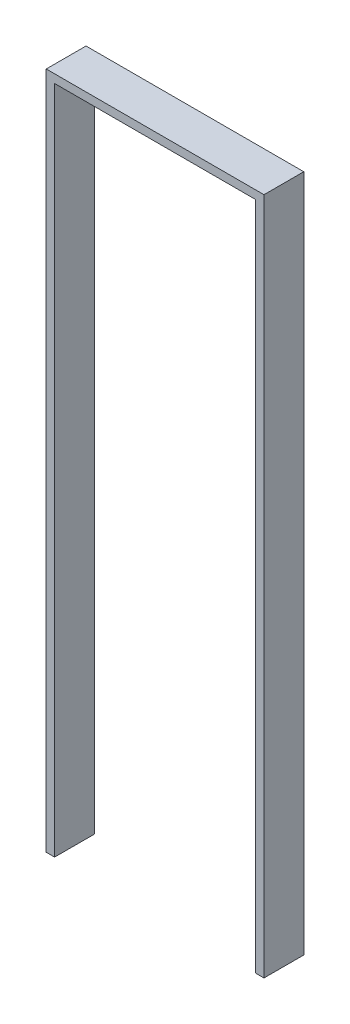
ISO-10303-21;
HEADER;
FILE_DESCRIPTION(('STEP AP214'),'2;1');
FILE_NAME('part.step','',(''),(''),'','','');
FILE_SCHEMA(('AUTOMOTIVE_DESIGN { 1 0 10303 214 1 1 1 1 }'));
ENDSEC;
DATA;
#1=APPLICATION_CONTEXT('core data for automotive mechanical design processes');
#2=APPLICATION_PROTOCOL_DEFINITION('international standard','automotive_design',2000,#1);
#3=PRODUCT_CONTEXT('',#1,'mechanical');
#4=PRODUCT('Part','Part','',(#3));
#5=PRODUCT_RELATED_PRODUCT_CATEGORY('part','',(#4));
#6=PRODUCT_DEFINITION_FORMATION('','',#4);
#7=PRODUCT_DEFINITION_CONTEXT('part definition',#1,'design');
#8=PRODUCT_DEFINITION('design','',#6,#7);
#9=PRODUCT_DEFINITION_SHAPE('','',#8);
#10=(LENGTH_UNIT() NAMED_UNIT(*) SI_UNIT(.MILLI.,.METRE.));
#11=(NAMED_UNIT(*) PLANE_ANGLE_UNIT() SI_UNIT($,.RADIAN.));
#12=(NAMED_UNIT(*) SI_UNIT($,.STERADIAN.) SOLID_ANGLE_UNIT());
#13=UNCERTAINTY_MEASURE_WITH_UNIT(LENGTH_MEASURE(1.E-05),#10,'distance_accuracy_value','');
#14=(GEOMETRIC_REPRESENTATION_CONTEXT(3) GLOBAL_UNCERTAINTY_ASSIGNED_CONTEXT((#13)) GLOBAL_UNIT_ASSIGNED_CONTEXT((#10,
#11,#12)) REPRESENTATION_CONTEXT('',''));
#15=CARTESIAN_POINT('',(0.,0.,0.));
#16=DIRECTION('',(0.,0.,1.));
#17=DIRECTION('',(1.,0.,0.));
#18=AXIS2_PLACEMENT_3D('',#15,#16,#17);
#19=CARTESIAN_POINT('',(-330.2,0.,-120.65));
#20=DIRECTION('',(0.,-1.,0.));
#21=DIRECTION('',(0.,0.,-1.));
#22=AXIS2_PLACEMENT_3D('',#19,#20,#21);
#23=PLANE('',#22);
#24=DIRECTION('',(1.,0.,0.));
#25=VECTOR('',#24,1.);
#26=CARTESIAN_POINT('',(-330.2,0.,0.));
#27=LINE('',#26,#25);
#28=CARTESIAN_POINT('',(-330.2,0.,0.));
#29=VERTEX_POINT('',#28);
#30=CARTESIAN_POINT('',(-304.8,0.,0.));
#31=VERTEX_POINT('',#30);
#32=EDGE_CURVE('E129',#29,#31,#27,.T.);
#33=ORIENTED_EDGE('',*,*,#32,.F.);
#34=DIRECTION('',(0.,0.,1.));
#35=VECTOR('',#34,1.);
#36=CARTESIAN_POINT('',(-330.2,0.,-120.65));
#37=LINE('',#36,#35);
#38=CARTESIAN_POINT('',(-330.2,0.,-120.65));
#39=VERTEX_POINT('',#38);
#40=EDGE_CURVE('E11',#39,#29,#37,.T.);
#41=ORIENTED_EDGE('',*,*,#40,.F.);
#42=DIRECTION('',(1.,0.,0.));
#43=VECTOR('',#42,1.);
#44=CARTESIAN_POINT('',(-330.2,0.,-120.65));
#45=LINE('',#44,#43);
#46=CARTESIAN_POINT('',(-304.8,0.,-120.65));
#47=VERTEX_POINT('',#46);
#48=EDGE_CURVE('E149',#39,#47,#45,.T.);
#49=ORIENTED_EDGE('',*,*,#48,.T.);
#50=DIRECTION('',(0.,0.,1.));
#51=VECTOR('',#50,1.);
#52=CARTESIAN_POINT('',(-304.8,0.,-120.65));
#53=LINE('',#52,#51);
#54=EDGE_CURVE('E35',#47,#31,#53,.T.);
#55=ORIENTED_EDGE('',*,*,#54,.T.);
#56=EDGE_LOOP('',(#33,#41,#49,#55));
#57=FACE_BOUND('',#56,.T.);
#58=ADVANCED_FACE('F32',(#57),#23,.T.);
#59=CARTESIAN_POINT('',(-330.2,2057.4,-120.65));
#60=DIRECTION('',(-1.,0.,0.));
#61=DIRECTION('',(0.,0.,1.));
#62=AXIS2_PLACEMENT_3D('',#59,#60,#61);
#63=PLANE('',#62);
#64=DIRECTION('',(0.,-1.,0.));
#65=VECTOR('',#64,1.);
#66=CARTESIAN_POINT('',(-330.2,2057.4,0.));
#67=LINE('',#66,#65);
#68=CARTESIAN_POINT('',(-330.2,2057.4,0.));
#69=VERTEX_POINT('',#68);
#70=EDGE_CURVE('E147',#69,#29,#67,.T.);
#71=ORIENTED_EDGE('',*,*,#70,.F.);
#72=DIRECTION('',(0.,0.,1.));
#73=VECTOR('',#72,1.);
#74=CARTESIAN_POINT('',(-330.2,2057.4,-120.65));
#75=LINE('',#74,#73);
#76=CARTESIAN_POINT('',(-330.2,2057.4,-120.65));
#77=VERTEX_POINT('',#76);
#78=EDGE_CURVE('E41',#77,#69,#75,.T.);
#79=ORIENTED_EDGE('',*,*,#78,.F.);
#80=DIRECTION('',(0.,-1.,0.));
#81=VECTOR('',#80,1.);
#82=CARTESIAN_POINT('',(-330.2,2057.4,-120.65));
#83=LINE('',#82,#81);
#84=EDGE_CURVE('E119',#77,#39,#83,.T.);
#85=ORIENTED_EDGE('',*,*,#84,.T.);
#86=ORIENTED_EDGE('',*,*,#40,.T.);
#87=EDGE_LOOP('',(#71,#79,#85,#86));
#88=FACE_BOUND('',#87,.T.);
#89=ADVANCED_FACE('F161',(#88),#63,.T.);
#90=CARTESIAN_POINT('',(330.2,2057.4,-120.65));
#91=DIRECTION('',(0.,1.,0.));
#92=DIRECTION('',(0.,0.,1.));
#93=AXIS2_PLACEMENT_3D('',#90,#91,#92);
#94=PLANE('',#93);
#95=DIRECTION('',(-1.,0.,0.));
#96=VECTOR('',#95,1.);
#97=CARTESIAN_POINT('',(330.2,2057.4,0.));
#98=LINE('',#97,#96);
#99=CARTESIAN_POINT('',(330.2,2057.4,0.));
#100=VERTEX_POINT('',#99);
#101=EDGE_CURVE('E106',#100,#69,#98,.T.);
#102=ORIENTED_EDGE('',*,*,#101,.F.);
#103=DIRECTION('',(0.,0.,1.));
#104=VECTOR('',#103,1.);
#105=CARTESIAN_POINT('',(330.2,2057.4,-120.65));
#106=LINE('',#105,#104);
#107=CARTESIAN_POINT('',(330.2,2057.4,-120.65));
#108=VERTEX_POINT('',#107);
#109=EDGE_CURVE('E101',#108,#100,#106,.T.);
#110=ORIENTED_EDGE('',*,*,#109,.F.);
#111=DIRECTION('',(-1.,0.,0.));
#112=VECTOR('',#111,1.);
#113=CARTESIAN_POINT('',(330.2,2057.4,-120.65));
#114=LINE('',#113,#112);
#115=EDGE_CURVE('E104',#108,#77,#114,.T.);
#116=ORIENTED_EDGE('',*,*,#115,.T.);
#117=ORIENTED_EDGE('',*,*,#78,.T.);
#118=EDGE_LOOP('',(#102,#110,#116,#117));
#119=FACE_BOUND('',#118,.T.);
#120=ADVANCED_FACE('F103',(#119),#94,.T.);
#121=CARTESIAN_POINT('',(330.2,0.,-120.65));
#122=DIRECTION('',(1.,0.,0.));
#123=DIRECTION('',(0.,0.,-1.));
#124=AXIS2_PLACEMENT_3D('',#121,#122,#123);
#125=PLANE('',#124);
#126=DIRECTION('',(0.,1.,0.));
#127=VECTOR('',#126,1.);
#128=CARTESIAN_POINT('',(330.2,0.,0.));
#129=LINE('',#128,#127);
#130=CARTESIAN_POINT('',(330.2,0.,0.));
#131=VERTEX_POINT('',#130);
#132=EDGE_CURVE('E144',#131,#100,#129,.T.);
#133=ORIENTED_EDGE('',*,*,#132,.F.);
#134=DIRECTION('',(0.,0.,1.));
#135=VECTOR('',#134,1.);
#136=CARTESIAN_POINT('',(330.2,0.,-120.65));
#137=LINE('',#136,#135);
#138=CARTESIAN_POINT('',(330.2,0.,-120.65));
#139=VERTEX_POINT('',#138);
#140=EDGE_CURVE('E111',#139,#131,#137,.T.);
#141=ORIENTED_EDGE('',*,*,#140,.F.);
#142=DIRECTION('',(0.,1.,0.));
#143=VECTOR('',#142,1.);
#144=CARTESIAN_POINT('',(330.2,0.,-120.65));
#145=LINE('',#144,#143);
#146=EDGE_CURVE('E117',#139,#108,#145,.T.);
#147=ORIENTED_EDGE('',*,*,#146,.T.);
#148=ORIENTED_EDGE('',*,*,#109,.T.);
#149=EDGE_LOOP('',(#133,#141,#147,#148));
#150=FACE_BOUND('',#149,.T.);
#151=ADVANCED_FACE('F121',(#150),#125,.T.);
#152=CARTESIAN_POINT('',(304.8,0.,-120.65));
#153=DIRECTION('',(0.,-1.,0.));
#154=DIRECTION('',(0.,0.,-1.));
#155=AXIS2_PLACEMENT_3D('',#152,#153,#154);
#156=PLANE('',#155);
#157=DIRECTION('',(1.,0.,0.));
#158=VECTOR('',#157,1.);
#159=CARTESIAN_POINT('',(304.8,0.,0.));
#160=LINE('',#159,#158);
#161=CARTESIAN_POINT('',(304.8,0.,0.));
#162=VERTEX_POINT('',#161);
#163=EDGE_CURVE('E141',#162,#131,#160,.T.);
#164=ORIENTED_EDGE('',*,*,#163,.F.);
#165=DIRECTION('',(0.,0.,1.));
#166=VECTOR('',#165,1.);
#167=CARTESIAN_POINT('',(304.8,0.,-120.65));
#168=LINE('',#167,#166);
#169=CARTESIAN_POINT('',(304.8,0.,-120.65));
#170=VERTEX_POINT('',#169);
#171=EDGE_CURVE('E153',#170,#162,#168,.T.);
#172=ORIENTED_EDGE('',*,*,#171,.F.);
#173=DIRECTION('',(1.,0.,0.));
#174=VECTOR('',#173,1.);
#175=CARTESIAN_POINT('',(304.8,0.,-120.65));
#176=LINE('',#175,#174);
#177=EDGE_CURVE('E122',#170,#139,#176,.T.);
#178=ORIENTED_EDGE('',*,*,#177,.T.);
#179=ORIENTED_EDGE('',*,*,#140,.T.);
#180=EDGE_LOOP('',(#164,#172,#178,#179));
#181=FACE_BOUND('',#180,.T.);
#182=ADVANCED_FACE('F174',(#181),#156,.T.);
#183=CARTESIAN_POINT('',(304.8,2032.,-120.65));
#184=DIRECTION('',(-1.,0.,0.));
#185=DIRECTION('',(0.,0.,1.));
#186=AXIS2_PLACEMENT_3D('',#183,#184,#185);
#187=PLANE('',#186);
#188=DIRECTION('',(0.,-1.,0.));
#189=VECTOR('',#188,1.);
#190=CARTESIAN_POINT('',(304.8,2032.,0.));
#191=LINE('',#190,#189);
#192=CARTESIAN_POINT('',(304.8,2032.,0.));
#193=VERTEX_POINT('',#192);
#194=EDGE_CURVE('E138',#193,#162,#191,.T.);
#195=ORIENTED_EDGE('',*,*,#194,.F.);
#196=DIRECTION('',(0.,0.,1.));
#197=VECTOR('',#196,1.);
#198=CARTESIAN_POINT('',(304.8,2032.,-120.65));
#199=LINE('',#198,#197);
#200=CARTESIAN_POINT('',(304.8,2032.,-120.65));
#201=VERTEX_POINT('',#200);
#202=EDGE_CURVE('E155',#201,#193,#199,.T.);
#203=ORIENTED_EDGE('',*,*,#202,.F.);
#204=DIRECTION('',(0.,-1.,0.));
#205=VECTOR('',#204,1.);
#206=CARTESIAN_POINT('',(304.8,2032.,-120.65));
#207=LINE('',#206,#205);
#208=EDGE_CURVE('E124',#201,#170,#207,.T.);
#209=ORIENTED_EDGE('',*,*,#208,.T.);
#210=ORIENTED_EDGE('',*,*,#171,.T.);
#211=EDGE_LOOP('',(#195,#203,#209,#210));
#212=FACE_BOUND('',#211,.T.);
#213=ADVANCED_FACE('F177',(#212),#187,.T.);
#214=CARTESIAN_POINT('',(-304.8,2032.,-120.65));
#215=DIRECTION('',(0.,-1.,0.));
#216=DIRECTION('',(0.,0.,-1.));
#217=AXIS2_PLACEMENT_3D('',#214,#215,#216);
#218=PLANE('',#217);
#219=DIRECTION('',(1.,0.,0.));
#220=VECTOR('',#219,1.);
#221=CARTESIAN_POINT('',(-304.8,2032.,0.));
#222=LINE('',#221,#220);
#223=CARTESIAN_POINT('',(-304.8,2032.,0.));
#224=VERTEX_POINT('',#223);
#225=EDGE_CURVE('E135',#224,#193,#222,.T.);
#226=ORIENTED_EDGE('',*,*,#225,.F.);
#227=DIRECTION('',(0.,0.,1.));
#228=VECTOR('',#227,1.);
#229=CARTESIAN_POINT('',(-304.8,2032.,-120.65));
#230=LINE('',#229,#228);
#231=CARTESIAN_POINT('',(-304.8,2032.,-120.65));
#232=VERTEX_POINT('',#231);
#233=EDGE_CURVE('E156',#232,#224,#230,.T.);
#234=ORIENTED_EDGE('',*,*,#233,.F.);
#235=DIRECTION('',(1.,0.,0.));
#236=VECTOR('',#235,1.);
#237=CARTESIAN_POINT('',(-304.8,2032.,-120.65));
#238=LINE('',#237,#236);
#239=EDGE_CURVE('E252',#232,#201,#238,.T.);
#240=ORIENTED_EDGE('',*,*,#239,.T.);
#241=ORIENTED_EDGE('',*,*,#202,.T.);
#242=EDGE_LOOP('',(#226,#234,#240,#241));
#243=FACE_BOUND('',#242,.T.);
#244=ADVANCED_FACE('F181',(#243),#218,.T.);
#245=CARTESIAN_POINT('',(-304.8,0.,-120.65));
#246=DIRECTION('',(1.,0.,0.));
#247=DIRECTION('',(0.,0.,-1.));
#248=AXIS2_PLACEMENT_3D('',#245,#246,#247);
#249=PLANE('',#248);
#250=DIRECTION('',(0.,1.,0.));
#251=VECTOR('',#250,1.);
#252=CARTESIAN_POINT('',(-304.8,0.,0.));
#253=LINE('',#252,#251);
#254=EDGE_CURVE('E132',#31,#224,#253,.T.);
#255=ORIENTED_EDGE('',*,*,#254,.F.);
#256=ORIENTED_EDGE('',*,*,#54,.F.);
#257=DIRECTION('',(0.,1.,0.));
#258=VECTOR('',#257,1.);
#259=CARTESIAN_POINT('',(-304.8,0.,-120.65));
#260=LINE('',#259,#258);
#261=EDGE_CURVE('E253',#47,#232,#260,.T.);
#262=ORIENTED_EDGE('',*,*,#261,.T.);
#263=ORIENTED_EDGE('',*,*,#233,.T.);
#264=EDGE_LOOP('',(#255,#256,#262,#263));
#265=FACE_BOUND('',#264,.T.);
#266=ADVANCED_FACE('F158',(#265),#249,.T.);
#267=CARTESIAN_POINT('',(0.,0.,-120.65));
#268=DIRECTION('',(0.,0.,1.));
#269=DIRECTION('',(1.,0.,0.));
#270=AXIS2_PLACEMENT_3D('',#267,#268,#269);
#271=PLANE('',#270);
#272=ORIENTED_EDGE('',*,*,#48,.F.);
#273=ORIENTED_EDGE('',*,*,#84,.F.);
#274=ORIENTED_EDGE('',*,*,#115,.F.);
#275=ORIENTED_EDGE('',*,*,#146,.F.);
#276=ORIENTED_EDGE('',*,*,#177,.F.);
#277=ORIENTED_EDGE('',*,*,#208,.F.);
#278=ORIENTED_EDGE('',*,*,#239,.F.);
#279=ORIENTED_EDGE('',*,*,#261,.F.);
#280=EDGE_LOOP('',(#272,#273,#274,#275,#276,#277,#278,#279));
#281=FACE_BOUND('',#280,.T.);
#282=ADVANCED_FACE('F115',(#281),#271,.F.);
#283=CARTESIAN_POINT('',(0.,0.,0.));
#284=DIRECTION('',(0.,0.,1.));
#285=DIRECTION('',(1.,0.,0.));
#286=AXIS2_PLACEMENT_3D('',#283,#284,#285);
#287=PLANE('',#286);
#288=ORIENTED_EDGE('',*,*,#32,.T.);
#289=ORIENTED_EDGE('',*,*,#254,.T.);
#290=ORIENTED_EDGE('',*,*,#225,.T.);
#291=ORIENTED_EDGE('',*,*,#194,.T.);
#292=ORIENTED_EDGE('',*,*,#163,.T.);
#293=ORIENTED_EDGE('',*,*,#132,.T.);
#294=ORIENTED_EDGE('',*,*,#101,.T.);
#295=ORIENTED_EDGE('',*,*,#70,.T.);
#296=EDGE_LOOP('',(#288,#289,#290,#291,#292,#293,#294,#295));
#297=FACE_BOUND('',#296,.T.);
#298=ADVANCED_FACE('F160',(#297),#287,.T.);
#299=CLOSED_SHELL('',(#58,#89,#120,#151,#182,#213,#244,#266,#282,#298));
#300=MANIFOLD_SOLID_BREP('B2',#299);
#301=ADVANCED_BREP_SHAPE_REPRESENTATION('',(#18,#300),#14);
#302=SHAPE_DEFINITION_REPRESENTATION(#9,#301);
ENDSEC;
END-ISO-10303-21;
